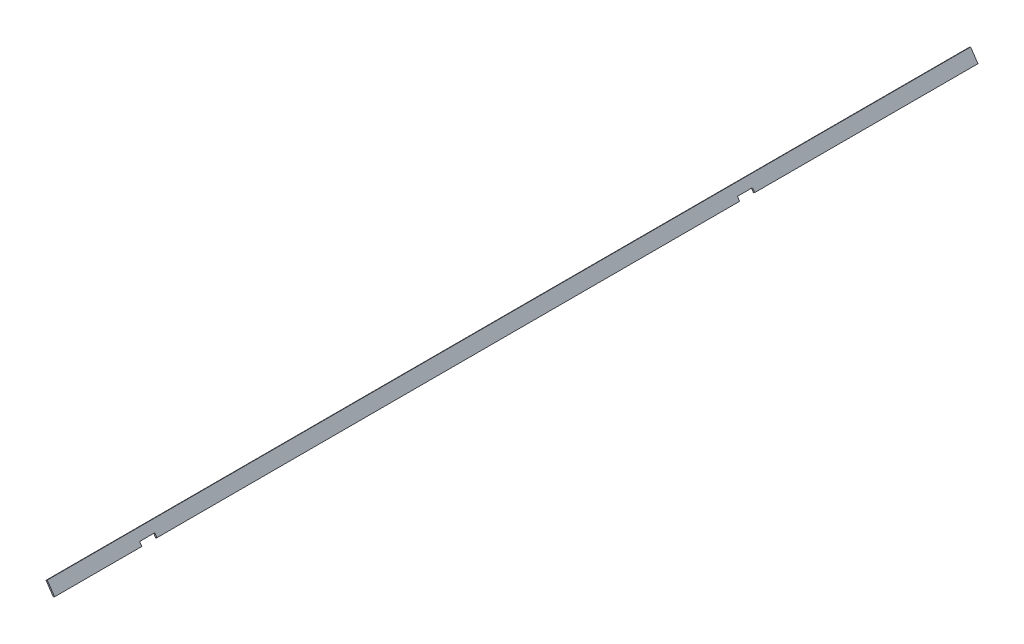
ISO-10303-21;
HEADER;
FILE_DESCRIPTION(('STEP AP214'),'2;1');
FILE_NAME('part.step','',(''),(''),'','','');
FILE_SCHEMA(('AUTOMOTIVE_DESIGN { 1 0 10303 214 1 1 1 1 }'));
ENDSEC;
DATA;
#1=APPLICATION_CONTEXT('core data for automotive mechanical design processes');
#2=APPLICATION_PROTOCOL_DEFINITION('international standard','automotive_design',2000,#1);
#3=PRODUCT_CONTEXT('',#1,'mechanical');
#4=PRODUCT('Part','Part','',(#3));
#5=PRODUCT_RELATED_PRODUCT_CATEGORY('part','',(#4));
#6=PRODUCT_DEFINITION_FORMATION('','',#4);
#7=PRODUCT_DEFINITION_CONTEXT('part definition',#1,'design');
#8=PRODUCT_DEFINITION('design','',#6,#7);
#9=PRODUCT_DEFINITION_SHAPE('','',#8);
#10=(LENGTH_UNIT() NAMED_UNIT(*) SI_UNIT(.MILLI.,.METRE.));
#11=(NAMED_UNIT(*) PLANE_ANGLE_UNIT() SI_UNIT($,.RADIAN.));
#12=(NAMED_UNIT(*) SI_UNIT($,.STERADIAN.) SOLID_ANGLE_UNIT());
#13=UNCERTAINTY_MEASURE_WITH_UNIT(LENGTH_MEASURE(1.E-05),#10,'distance_accuracy_value','');
#14=(GEOMETRIC_REPRESENTATION_CONTEXT(3) GLOBAL_UNCERTAINTY_ASSIGNED_CONTEXT((#13)) GLOBAL_UNIT_ASSIGNED_CONTEXT((#10,
#11,#12)) REPRESENTATION_CONTEXT('',''));
#15=CARTESIAN_POINT('',(0.,0.,0.));
#16=DIRECTION('',(0.,0.,1.));
#17=DIRECTION('',(1.,0.,0.));
#18=AXIS2_PLACEMENT_3D('',#15,#16,#17);
#19=CARTESIAN_POINT('',(30.4732522687183,4.69794676455998,-1999.81912515072));
#20=DIRECTION('',(-0.565982254853329,0.824417422906104,0.));
#21=DIRECTION('',(-0.824417422906104,-0.565982254853329,0.));
#22=AXIS2_PLACEMENT_3D('',#19,#20,#21);
#23=PLANE('',#22);
#24=DIRECTION('',(0.,0.,1.));
#25=VECTOR('',#24,1.);
#26=CARTESIAN_POINT('',(27.9999999999999,3.,-1999.81912515072));
#27=LINE('',#26,#25);
#28=CARTESIAN_POINT('',(28.,2.99999999999998,-179.5));
#29=VERTEX_POINT('',#28);
#30=CARTESIAN_POINT('',(27.9999999999999,3.,0.));
#31=VERTEX_POINT('',#30);
#32=EDGE_CURVE('E142',#29,#31,#27,.T.);
#33=ORIENTED_EDGE('',*,*,#32,.F.);
#34=DIRECTION('',(0.824417422906102,0.565982254853331,0.));
#35=VECTOR('',#34,1.);
#36=CARTESIAN_POINT('',(17.6136990594956,-4.1304437079582,-179.5));
#37=LINE('',#36,#35);
#38=CARTESIAN_POINT('',(30.4732522687183,4.69794676455998,-179.5));
#39=VERTEX_POINT('',#38);
#40=EDGE_CURVE('E127',#29,#39,#37,.T.);
#41=ORIENTED_EDGE('',*,*,#40,.T.);
#42=DIRECTION('',(0.,0.,1.));
#43=VECTOR('',#42,1.);
#44=CARTESIAN_POINT('',(30.4732522687183,4.69794676455998,-1999.81912515072));
#45=LINE('',#44,#43);
#46=CARTESIAN_POINT('',(30.4732522687183,4.69794676455998,0.));
#47=VERTEX_POINT('',#46);
#48=EDGE_CURVE('E140',#39,#47,#45,.T.);
#49=ORIENTED_EDGE('',*,*,#48,.T.);
#50=DIRECTION('',(-0.824417422906104,-0.565982254853329,0.));
#51=VECTOR('',#50,1.);
#52=CARTESIAN_POINT('',(30.4732522687183,4.69794676455998,0.));
#53=LINE('',#52,#51);
#54=EDGE_CURVE('E172',#47,#31,#53,.T.);
#55=ORIENTED_EDGE('',*,*,#54,.T.);
#56=EDGE_LOOP('',(#33,#41,#49,#55));
#57=FACE_BOUND('',#56,.T.);
#58=ADVANCED_FACE('F34',(#57),#23,.F.);
#59=CARTESIAN_POINT('',(30.4732522687181,4.69794676455998,-1409.5));
#60=VERTEX_POINT('',#59);
#61=CARTESIAN_POINT('',(30.4732522687183,4.69794676455998,-210.5));
#62=VERTEX_POINT('',#61);
#63=EDGE_CURVE('E149',#60,#62,#45,.T.);
#64=ORIENTED_EDGE('',*,*,#63,.T.);
#65=DIRECTION('',(0.824417422906102,0.565982254853331,0.));
#66=VECTOR('',#65,1.);
#67=CARTESIAN_POINT('',(17.6136990594956,-4.1304437079582,-210.500000000001));
#68=LINE('',#67,#66);
#69=CARTESIAN_POINT('',(27.9999999999999,2.99999999999998,-210.5));
#70=VERTEX_POINT('',#69);
#71=EDGE_CURVE('E49',#70,#62,#68,.T.);
#72=ORIENTED_EDGE('',*,*,#71,.F.);
#73=CARTESIAN_POINT('',(27.9999999999998,2.99999999999998,-1409.5));
#74=VERTEX_POINT('',#73);
#75=EDGE_CURVE('E155',#74,#70,#27,.T.);
#76=ORIENTED_EDGE('',*,*,#75,.F.);
#77=DIRECTION('',(0.824417422906104,0.565982254853329,0.));
#78=VECTOR('',#77,1.);
#79=CARTESIAN_POINT('',(30.4732522687181,4.69794676455998,-1409.5));
#80=LINE('',#79,#78);
#81=EDGE_CURVE('E11',#74,#60,#80,.T.);
#82=ORIENTED_EDGE('',*,*,#81,.T.);
#83=EDGE_LOOP('',(#64,#72,#76,#82));
#84=FACE_BOUND('',#83,.T.);
#85=ADVANCED_FACE('F226',(#84),#23,.F.);
#86=CARTESIAN_POINT('',(12.71847911896,25.2592704184648,-1999.81912515072));
#87=DIRECTION('',(-0.824417422906102,-0.565982254853331,0.));
#88=DIRECTION('',(0.565982254853331,-0.824417422906102,0.));
#89=AXIS2_PLACEMENT_3D('',#86,#87,#88);
#90=PLANE('',#89);
#91=DIRECTION('',(-0.565982254853331,0.824417422906102,0.));
#92=VECTOR('',#91,1.);
#93=CARTESIAN_POINT('',(12.71847911896,25.2592704184648,-179.5));
#94=LINE('',#93,#92);
#95=CARTESIAN_POINT('',(23.4721419611733,9.5953393832488,-179.500000000001));
#96=VERTEX_POINT('',#95);
#97=EDGE_CURVE('E203',#29,#96,#94,.T.);
#98=ORIENTED_EDGE('',*,*,#97,.F.);
#99=ORIENTED_EDGE('',*,*,#32,.T.);
#100=DIRECTION('',(0.565982254853331,-0.824417422906102,0.));
#101=VECTOR('',#100,1.);
#102=CARTESIAN_POINT('',(12.71847911896,25.2592704184648,0.));
#103=LINE('',#102,#101);
#104=CARTESIAN_POINT('',(12.71847911896,25.2592704184648,0.));
#105=VERTEX_POINT('',#104);
#106=EDGE_CURVE('E174',#105,#31,#103,.T.);
#107=ORIENTED_EDGE('',*,*,#106,.F.);
#108=DIRECTION('',(0.,0.,1.));
#109=VECTOR('',#108,1.);
#110=CARTESIAN_POINT('',(12.71847911896,25.2592704184648,-1999.81912515072));
#111=LINE('',#110,#109);
#112=CARTESIAN_POINT('',(12.71847911896,25.2592704184648,-1900.));
#113=VERTEX_POINT('',#112);
#114=EDGE_CURVE('E163',#113,#105,#111,.T.);
#115=ORIENTED_EDGE('',*,*,#114,.F.);
#116=DIRECTION('',(0.565982254853331,-0.824417422906102,0.));
#117=VECTOR('',#116,1.);
#118=CARTESIAN_POINT('',(12.71847911896,25.2592704184648,-1900.));
#119=LINE('',#118,#117);
#120=CARTESIAN_POINT('',(27.9999999999999,3.,-1900.));
#121=VERTEX_POINT('',#120);
#122=EDGE_CURVE('E182',#113,#121,#119,.T.);
#123=ORIENTED_EDGE('',*,*,#122,.T.);
#124=CARTESIAN_POINT('',(27.9999999999997,3.,-1440.5));
#125=VERTEX_POINT('',#124);
#126=EDGE_CURVE('E150',#121,#125,#27,.T.);
#127=ORIENTED_EDGE('',*,*,#126,.T.);
#128=DIRECTION('',(0.565982254853331,-0.824417422906102,0.));
#129=VECTOR('',#128,1.);
#130=CARTESIAN_POINT('',(12.7184791189598,25.2592704184648,-1440.5));
#131=LINE('',#130,#129);
#132=CARTESIAN_POINT('',(23.4721419611731,9.5953393832488,-1440.5));
#133=VERTEX_POINT('',#132);
#134=EDGE_CURVE('E57',#133,#125,#131,.T.);
#135=ORIENTED_EDGE('',*,*,#134,.F.);
#136=DIRECTION('',(0.,0.,-1.));
#137=VECTOR('',#136,1.);
#138=CARTESIAN_POINT('',(23.4721419611733,9.59533938324886,-1999.81912515072));
#139=LINE('',#138,#137);
#140=CARTESIAN_POINT('',(23.4721419611731,9.5953393832488,-1409.5));
#141=VERTEX_POINT('',#140);
#142=EDGE_CURVE('E185',#141,#133,#139,.T.);
#143=ORIENTED_EDGE('',*,*,#142,.F.);
#144=DIRECTION('',(-0.565982254853331,0.824417422906102,0.));
#145=VECTOR('',#144,1.);
#146=CARTESIAN_POINT('',(12.7184791189598,25.2592704184648,-1409.5));
#147=LINE('',#146,#145);
#148=EDGE_CURVE('E188',#74,#141,#147,.T.);
#149=ORIENTED_EDGE('',*,*,#148,.F.);
#150=ORIENTED_EDGE('',*,*,#75,.T.);
#151=DIRECTION('',(0.565982254853331,-0.824417422906102,0.));
#152=VECTOR('',#151,1.);
#153=CARTESIAN_POINT('',(12.71847911896,25.2592704184648,-210.500000000001));
#154=LINE('',#153,#152);
#155=CARTESIAN_POINT('',(23.4721419611733,9.5953393832488,-210.500000000001));
#156=VERTEX_POINT('',#155);
#157=EDGE_CURVE('E207',#156,#70,#154,.T.);
#158=ORIENTED_EDGE('',*,*,#157,.F.);
#159=DIRECTION('',(0.,0.,-1.));
#160=VECTOR('',#159,1.);
#161=CARTESIAN_POINT('',(23.4721419611732,9.59533938324897,-1999.81912515072));
#162=LINE('',#161,#160);
#163=EDGE_CURVE('E205',#96,#156,#162,.T.);
#164=ORIENTED_EDGE('',*,*,#163,.F.);
#165=EDGE_LOOP('',(#98,#99,#107,#115,#123,#127,#135,#143,#149,#150,#158,#164));
#166=FACE_BOUND('',#165,.T.);
#167=ADVANCED_FACE('F36',(#166),#90,.T.);
#168=CARTESIAN_POINT('',(12.71847911896,25.2592704184648,-1999.81912515072));
#169=DIRECTION('',(0.565982254853331,-0.824417422906102,0.));
#170=DIRECTION('',(0.824417422906102,0.565982254853331,0.));
#171=AXIS2_PLACEMENT_3D('',#168,#169,#170);
#172=PLANE('',#171);
#173=DIRECTION('',(-0.824417422906102,-0.565982254853331,0.));
#174=VECTOR('',#173,1.);
#175=CARTESIAN_POINT('',(12.71847911896,25.2592704184648,-1900.));
#176=LINE('',#175,#174);
#177=CARTESIAN_POINT('',(15.1917313876783,26.9572171830247,-1900.));
#178=VERTEX_POINT('',#177);
#179=EDGE_CURVE('E178',#113,#178,#176,.F.);
#180=ORIENTED_EDGE('',*,*,#179,.F.);
#181=ORIENTED_EDGE('',*,*,#114,.T.);
#182=DIRECTION('',(0.824417422906102,0.565982254853331,0.));
#183=VECTOR('',#182,1.);
#184=CARTESIAN_POINT('',(12.71847911896,25.2592704184648,0.));
#185=LINE('',#184,#183);
#186=CARTESIAN_POINT('',(15.1917313876783,26.9572171830247,0.));
#187=VERTEX_POINT('',#186);
#188=EDGE_CURVE('E169',#105,#187,#185,.T.);
#189=ORIENTED_EDGE('',*,*,#188,.T.);
#190=DIRECTION('',(0.,0.,1.));
#191=VECTOR('',#190,1.);
#192=CARTESIAN_POINT('',(15.1917313876783,26.9572171830247,-1999.81912515072));
#193=LINE('',#192,#191);
#194=EDGE_CURVE('E159',#178,#187,#193,.T.);
#195=ORIENTED_EDGE('',*,*,#194,.F.);
#196=EDGE_LOOP('',(#180,#181,#189,#195));
#197=FACE_BOUND('',#196,.T.);
#198=ADVANCED_FACE('F240',(#197),#172,.F.);
#199=CARTESIAN_POINT('',(15.1917313876783,26.9572171830247,-1999.81912515072));
#200=DIRECTION('',(-0.824417422906102,-0.565982254853332,0.));
#201=DIRECTION('',(0.565982254853331,-0.824417422906102,0.));
#202=AXIS2_PLACEMENT_3D('',#199,#200,#201);
#203=PLANE('',#202);
#204=ORIENTED_EDGE('',*,*,#48,.F.);
#205=DIRECTION('',(0.565982254853331,-0.824417422906102,0.));
#206=VECTOR('',#205,1.);
#207=CARTESIAN_POINT('',(30.4732522687183,4.69794676455998,-179.5));
#208=LINE('',#207,#206);
#209=CARTESIAN_POINT('',(25.9453942298916,11.2932861478088,-179.5));
#210=VERTEX_POINT('',#209);
#211=EDGE_CURVE('E124',#210,#39,#208,.T.);
#212=ORIENTED_EDGE('',*,*,#211,.F.);
#213=DIRECTION('',(0.,0.,1.));
#214=VECTOR('',#213,1.);
#215=CARTESIAN_POINT('',(25.9453942298916,11.2932861478088,-179.5));
#216=LINE('',#215,#214);
#217=CARTESIAN_POINT('',(25.9453942298916,11.2932861478088,-210.5));
#218=VERTEX_POINT('',#217);
#219=EDGE_CURVE('E143',#218,#210,#216,.T.);
#220=ORIENTED_EDGE('',*,*,#219,.F.);
#221=DIRECTION('',(-0.565982254853332,0.824417422906102,0.));
#222=VECTOR('',#221,1.);
#223=CARTESIAN_POINT('',(30.4732522687183,4.69794676455998,-210.5));
#224=LINE('',#223,#222);
#225=EDGE_CURVE('E135',#62,#218,#224,.T.);
#226=ORIENTED_EDGE('',*,*,#225,.F.);
#227=ORIENTED_EDGE('',*,*,#63,.F.);
#228=DIRECTION('',(0.565982254853332,-0.824417422906102,0.));
#229=VECTOR('',#228,1.);
#230=CARTESIAN_POINT('',(30.4732522687181,4.69794676455998,-1409.5));
#231=LINE('',#230,#229);
#232=CARTESIAN_POINT('',(25.9453942298914,11.2932861478088,-1409.5));
#233=VERTEX_POINT('',#232);
#234=EDGE_CURVE('E201',#233,#60,#231,.T.);
#235=ORIENTED_EDGE('',*,*,#234,.F.);
#236=DIRECTION('',(0.,0.,1.));
#237=VECTOR('',#236,1.);
#238=CARTESIAN_POINT('',(25.9453942298914,11.2932861478088,-1409.5));
#239=LINE('',#238,#237);
#240=CARTESIAN_POINT('',(25.9453942298914,11.2932861478088,-1440.5));
#241=VERTEX_POINT('',#240);
#242=EDGE_CURVE('E194',#241,#233,#239,.T.);
#243=ORIENTED_EDGE('',*,*,#242,.F.);
#244=DIRECTION('',(-0.565982254853332,0.824417422906102,0.));
#245=VECTOR('',#244,1.);
#246=CARTESIAN_POINT('',(30.4732522687181,4.69794676455998,-1440.5));
#247=LINE('',#246,#245);
#248=CARTESIAN_POINT('',(30.4732522687181,4.69794676455998,-1440.5));
#249=VERTEX_POINT('',#248);
#250=EDGE_CURVE('E198',#249,#241,#247,.T.);
#251=ORIENTED_EDGE('',*,*,#250,.F.);
#252=CARTESIAN_POINT('',(30.4732522687182,4.69794676455998,-1900.));
#253=VERTEX_POINT('',#252);
#254=EDGE_CURVE('E152',#253,#249,#45,.T.);
#255=ORIENTED_EDGE('',*,*,#254,.F.);
#256=DIRECTION('',(0.565982254853331,-0.824417422906102,0.));
#257=VECTOR('',#256,1.);
#258=CARTESIAN_POINT('',(15.1917313876783,26.9572171830247,-1900.));
#259=LINE('',#258,#257);
#260=EDGE_CURVE('E180',#178,#253,#259,.T.);
#261=ORIENTED_EDGE('',*,*,#260,.F.);
#262=ORIENTED_EDGE('',*,*,#194,.T.);
#263=DIRECTION('',(0.565982254853332,-0.824417422906102,0.));
#264=VECTOR('',#263,1.);
#265=CARTESIAN_POINT('',(15.1917313876783,26.9572171830247,0.));
#266=LINE('',#265,#264);
#267=EDGE_CURVE('E147',#187,#47,#266,.T.);
#268=ORIENTED_EDGE('',*,*,#267,.T.);
#269=EDGE_LOOP('',(#204,#212,#220,#226,#227,#235,#243,#251,#255,#261,#262,#268));
#270=FACE_BOUND('',#269,.T.);
#271=ADVANCED_FACE('F145',(#270),#203,.F.);
#272=ORIENTED_EDGE('',*,*,#254,.T.);
#273=DIRECTION('',(-0.824417422906104,-0.565982254853329,0.));
#274=VECTOR('',#273,1.);
#275=CARTESIAN_POINT('',(30.4732522687181,4.69794676455998,-1440.5));
#276=LINE('',#275,#274);
#277=EDGE_CURVE('E42',#249,#125,#276,.T.);
#278=ORIENTED_EDGE('',*,*,#277,.T.);
#279=ORIENTED_EDGE('',*,*,#126,.F.);
#280=DIRECTION('',(-0.824417422906102,-0.565982254853331,0.));
#281=VECTOR('',#280,1.);
#282=CARTESIAN_POINT('',(27.9999999999999,3.,-1900.));
#283=LINE('',#282,#281);
#284=EDGE_CURVE('E177',#121,#253,#283,.F.);
#285=ORIENTED_EDGE('',*,*,#284,.T.);
#286=EDGE_LOOP('',(#272,#278,#279,#285));
#287=FACE_BOUND('',#286,.T.);
#288=ADVANCED_FACE('F247',(#287),#23,.F.);
#289=CARTESIAN_POINT('',(0.,0.,0.));
#290=DIRECTION('',(0.,0.,-1.));
#291=DIRECTION('',(-1.,0.,0.));
#292=AXIS2_PLACEMENT_3D('',#289,#290,#291);
#293=PLANE('',#292);
#294=ORIENTED_EDGE('',*,*,#106,.T.);
#295=ORIENTED_EDGE('',*,*,#54,.F.);
#296=ORIENTED_EDGE('',*,*,#267,.F.);
#297=ORIENTED_EDGE('',*,*,#188,.F.);
#298=EDGE_LOOP('',(#294,#295,#296,#297));
#299=FACE_BOUND('',#298,.T.);
#300=ADVANCED_FACE('F245',(#299),#293,.F.);
#301=CARTESIAN_POINT('',(12.71847911896,25.2592704184648,-1900.));
#302=DIRECTION('',(0.,0.,-1.));
#303=DIRECTION('',(0.565982254853331,-0.824417422906102,0.));
#304=AXIS2_PLACEMENT_3D('',#301,#302,#303);
#305=PLANE('',#304);
#306=ORIENTED_EDGE('',*,*,#284,.F.);
#307=ORIENTED_EDGE('',*,*,#122,.F.);
#308=ORIENTED_EDGE('',*,*,#179,.T.);
#309=ORIENTED_EDGE('',*,*,#260,.T.);
#310=EDGE_LOOP('',(#306,#307,#308,#309));
#311=FACE_BOUND('',#310,.T.);
#312=ADVANCED_FACE('F248',(#311),#305,.T.);
#313=CARTESIAN_POINT('',(17.6136990594954,-4.1304437079582,-1409.5));
#314=DIRECTION('',(0.,0.,1.));
#315=DIRECTION('',(1.,0.,0.));
#316=AXIS2_PLACEMENT_3D('',#313,#314,#315);
#317=PLANE('',#316);
#318=ORIENTED_EDGE('',*,*,#148,.T.);
#319=DIRECTION('',(0.824417422906102,0.565982254853331,0.));
#320=VECTOR('',#319,1.);
#321=CARTESIAN_POINT('',(13.0858410206688,2.4648956752906,-1409.5));
#322=LINE('',#321,#320);
#323=EDGE_CURVE('E191',#141,#233,#322,.T.);
#324=ORIENTED_EDGE('',*,*,#323,.T.);
#325=ORIENTED_EDGE('',*,*,#234,.T.);
#326=ORIENTED_EDGE('',*,*,#81,.F.);
#327=EDGE_LOOP('',(#318,#324,#325,#326));
#328=FACE_BOUND('',#327,.T.);
#329=ADVANCED_FACE('F231',(#328),#317,.F.);
#330=CARTESIAN_POINT('',(13.0858410206688,2.4648956752906,-1409.5));
#331=DIRECTION('',(-0.565982254853331,0.824417422906102,0.));
#332=DIRECTION('',(-0.824417422906102,-0.565982254853332,0.));
#333=AXIS2_PLACEMENT_3D('',#330,#331,#332);
#334=PLANE('',#333);
#335=ORIENTED_EDGE('',*,*,#142,.T.);
#336=DIRECTION('',(0.824417422906102,0.565982254853331,0.));
#337=VECTOR('',#336,1.);
#338=CARTESIAN_POINT('',(13.0858410206688,2.4648956752906,-1440.5));
#339=LINE('',#338,#337);
#340=EDGE_CURVE('E192',#133,#241,#339,.T.);
#341=ORIENTED_EDGE('',*,*,#340,.T.);
#342=ORIENTED_EDGE('',*,*,#242,.T.);
#343=ORIENTED_EDGE('',*,*,#323,.F.);
#344=EDGE_LOOP('',(#335,#341,#342,#343));
#345=FACE_BOUND('',#344,.T.);
#346=ADVANCED_FACE('F235',(#345),#334,.F.);
#347=CARTESIAN_POINT('',(17.6136990594954,-4.1304437079582,-1440.5));
#348=DIRECTION('',(0.,0.,-1.));
#349=DIRECTION('',(-1.,0.,0.));
#350=AXIS2_PLACEMENT_3D('',#347,#348,#349);
#351=PLANE('',#350);
#352=ORIENTED_EDGE('',*,*,#134,.T.);
#353=ORIENTED_EDGE('',*,*,#277,.F.);
#354=ORIENTED_EDGE('',*,*,#250,.T.);
#355=ORIENTED_EDGE('',*,*,#340,.F.);
#356=EDGE_LOOP('',(#352,#353,#354,#355));
#357=FACE_BOUND('',#356,.T.);
#358=ADVANCED_FACE('F236',(#357),#351,.F.);
#359=CARTESIAN_POINT('',(17.6136990594956,-4.1304437079582,-179.5));
#360=DIRECTION('',(0.,0.,1.));
#361=DIRECTION('',(1.,0.,0.));
#362=AXIS2_PLACEMENT_3D('',#359,#360,#361);
#363=PLANE('',#362);
#364=ORIENTED_EDGE('',*,*,#97,.T.);
#365=DIRECTION('',(0.824417422906102,0.565982254853331,0.));
#366=VECTOR('',#365,1.);
#367=CARTESIAN_POINT('',(13.085841020669,2.4648956752906,-179.5));
#368=LINE('',#367,#366);
#369=EDGE_CURVE('E130',#96,#210,#368,.T.);
#370=ORIENTED_EDGE('',*,*,#369,.T.);
#371=ORIENTED_EDGE('',*,*,#211,.T.);
#372=ORIENTED_EDGE('',*,*,#40,.F.);
#373=EDGE_LOOP('',(#364,#370,#371,#372));
#374=FACE_BOUND('',#373,.T.);
#375=ADVANCED_FACE('F126',(#374),#363,.F.);
#376=CARTESIAN_POINT('',(13.085841020669,2.4648956752906,-179.5));
#377=DIRECTION('',(-0.565982254853331,0.824417422906102,0.));
#378=DIRECTION('',(-0.824417422906102,-0.565982254853332,0.));
#379=AXIS2_PLACEMENT_3D('',#376,#377,#378);
#380=PLANE('',#379);
#381=ORIENTED_EDGE('',*,*,#163,.T.);
#382=DIRECTION('',(0.824417422906102,0.565982254853331,0.));
#383=VECTOR('',#382,1.);
#384=CARTESIAN_POINT('',(13.085841020669,2.4648956752906,-210.500000000001));
#385=LINE('',#384,#383);
#386=EDGE_CURVE('E210',#156,#218,#385,.T.);
#387=ORIENTED_EDGE('',*,*,#386,.T.);
#388=ORIENTED_EDGE('',*,*,#219,.T.);
#389=ORIENTED_EDGE('',*,*,#369,.F.);
#390=EDGE_LOOP('',(#381,#387,#388,#389));
#391=FACE_BOUND('',#390,.T.);
#392=ADVANCED_FACE('F219',(#391),#380,.F.);
#393=CARTESIAN_POINT('',(17.6136990594956,-4.1304437079582,-210.500000000001));
#394=DIRECTION('',(0.,0.,-1.));
#395=DIRECTION('',(-1.,0.,0.));
#396=AXIS2_PLACEMENT_3D('',#393,#394,#395);
#397=PLANE('',#396);
#398=ORIENTED_EDGE('',*,*,#157,.T.);
#399=ORIENTED_EDGE('',*,*,#71,.T.);
#400=ORIENTED_EDGE('',*,*,#225,.T.);
#401=ORIENTED_EDGE('',*,*,#386,.F.);
#402=EDGE_LOOP('',(#398,#399,#400,#401));
#403=FACE_BOUND('',#402,.T.);
#404=ADVANCED_FACE('F215',(#403),#397,.F.);
#405=CLOSED_SHELL('',(#58,#85,#167,#198,#271,#288,#300,#312,#329,#346,#358,#375,#392,#404));
#406=MANIFOLD_SOLID_BREP('B2',#405);
#407=ADVANCED_BREP_SHAPE_REPRESENTATION('',(#18,#406),#14);
#408=SHAPE_DEFINITION_REPRESENTATION(#9,#407);
ENDSEC;
END-ISO-10303-21;
